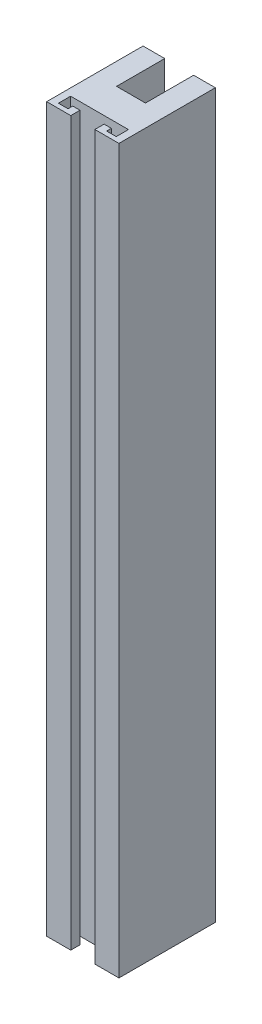
ISO-10303-21;
HEADER;
FILE_DESCRIPTION(('STEP AP214'),'2;1');
FILE_NAME('part.step','',(''),(''),'','','');
FILE_SCHEMA(('AUTOMOTIVE_DESIGN { 1 0 10303 214 1 1 1 1 }'));
ENDSEC;
DATA;
#1=APPLICATION_CONTEXT('core data for automotive mechanical design processes');
#2=APPLICATION_PROTOCOL_DEFINITION('international standard','automotive_design',2000,#1);
#3=PRODUCT_CONTEXT('',#1,'mechanical');
#4=PRODUCT('Part','Part','',(#3));
#5=PRODUCT_RELATED_PRODUCT_CATEGORY('part','',(#4));
#6=PRODUCT_DEFINITION_FORMATION('','',#4);
#7=PRODUCT_DEFINITION_CONTEXT('part definition',#1,'design');
#8=PRODUCT_DEFINITION('design','',#6,#7);
#9=PRODUCT_DEFINITION_SHAPE('','',#8);
#10=(LENGTH_UNIT() NAMED_UNIT(*) SI_UNIT(.MILLI.,.METRE.));
#11=(NAMED_UNIT(*) PLANE_ANGLE_UNIT() SI_UNIT($,.RADIAN.));
#12=(NAMED_UNIT(*) SI_UNIT($,.STERADIAN.) SOLID_ANGLE_UNIT());
#13=UNCERTAINTY_MEASURE_WITH_UNIT(LENGTH_MEASURE(1.E-05),#10,'distance_accuracy_value','');
#14=(GEOMETRIC_REPRESENTATION_CONTEXT(3) GLOBAL_UNCERTAINTY_ASSIGNED_CONTEXT((#13)) GLOBAL_UNIT_ASSIGNED_CONTEXT((#10,
#11,#12)) REPRESENTATION_CONTEXT('',''));
#15=CARTESIAN_POINT('',(0.,0.,0.));
#16=DIRECTION('',(0.,0.,1.));
#17=DIRECTION('',(1.,0.,0.));
#18=AXIS2_PLACEMENT_3D('',#15,#16,#17);
#19=CARTESIAN_POINT('',(3.,150.,-7.5));
#20=DIRECTION('',(0.,0.,1.));
#21=DIRECTION('',(1.,0.,0.));
#22=AXIS2_PLACEMENT_3D('',#19,#20,#21);
#23=PLANE('',#22);
#24=DIRECTION('',(-1.,0.,0.));
#25=VECTOR('',#24,1.);
#26=CARTESIAN_POINT('',(3.,0.,-7.5));
#27=LINE('',#26,#25);
#28=CARTESIAN_POINT('',(7.5,0.,-7.5));
#29=VERTEX_POINT('',#28);
#30=CARTESIAN_POINT('',(3.,0.,-7.5));
#31=VERTEX_POINT('',#30);
#32=EDGE_CURVE('E208',#29,#31,#27,.T.);
#33=ORIENTED_EDGE('',*,*,#32,.T.);
#34=DIRECTION('',(0.,-1.,0.));
#35=VECTOR('',#34,1.);
#36=CARTESIAN_POINT('',(3.,150.,-7.5));
#37=LINE('',#36,#35);
#38=CARTESIAN_POINT('',(3.,150.,-7.5));
#39=VERTEX_POINT('',#38);
#40=EDGE_CURVE('E44',#39,#31,#37,.T.);
#41=ORIENTED_EDGE('',*,*,#40,.F.);
#42=DIRECTION('',(-1.,0.,0.));
#43=VECTOR('',#42,1.);
#44=CARTESIAN_POINT('',(3.,150.,-7.5));
#45=LINE('',#44,#43);
#46=CARTESIAN_POINT('',(7.5,150.,-7.5));
#47=VERTEX_POINT('',#46);
#48=EDGE_CURVE('E132',#47,#39,#45,.T.);
#49=ORIENTED_EDGE('',*,*,#48,.F.);
#50=DIRECTION('',(0.,-1.,0.));
#51=VECTOR('',#50,1.);
#52=CARTESIAN_POINT('',(7.5,150.,-7.5));
#53=LINE('',#52,#51);
#54=EDGE_CURVE('E11',#47,#29,#53,.T.);
#55=ORIENTED_EDGE('',*,*,#54,.T.);
#56=EDGE_LOOP('',(#33,#41,#49,#55));
#57=FACE_BOUND('',#56,.T.);
#58=ADVANCED_FACE('F36',(#57),#23,.F.);
#59=CARTESIAN_POINT('',(3.,150.,2.5));
#60=DIRECTION('',(1.,0.,0.));
#61=DIRECTION('',(0.,0.,-1.));
#62=AXIS2_PLACEMENT_3D('',#59,#60,#61);
#63=PLANE('',#62);
#64=DIRECTION('',(0.,0.,1.));
#65=VECTOR('',#64,1.);
#66=CARTESIAN_POINT('',(3.,0.,2.5));
#67=LINE('',#66,#65);
#68=CARTESIAN_POINT('',(3.,0.,2.5));
#69=VERTEX_POINT('',#68);
#70=EDGE_CURVE('E210',#31,#69,#67,.T.);
#71=ORIENTED_EDGE('',*,*,#70,.T.);
#72=DIRECTION('',(0.,-1.,0.));
#73=VECTOR('',#72,1.);
#74=CARTESIAN_POINT('',(3.,150.,2.5));
#75=LINE('',#74,#73);
#76=CARTESIAN_POINT('',(3.,150.,2.5));
#77=VERTEX_POINT('',#76);
#78=EDGE_CURVE('E288',#77,#69,#75,.T.);
#79=ORIENTED_EDGE('',*,*,#78,.F.);
#80=DIRECTION('',(0.,0.,1.));
#81=VECTOR('',#80,1.);
#82=CARTESIAN_POINT('',(3.,150.,2.5));
#83=LINE('',#82,#81);
#84=EDGE_CURVE('E296',#39,#77,#83,.T.);
#85=ORIENTED_EDGE('',*,*,#84,.F.);
#86=ORIENTED_EDGE('',*,*,#40,.T.);
#87=EDGE_LOOP('',(#71,#79,#85,#86));
#88=FACE_BOUND('',#87,.T.);
#89=ADVANCED_FACE('F294',(#88),#63,.F.);
#90=CARTESIAN_POINT('',(-3.,150.,2.5));
#91=DIRECTION('',(0.,0.,1.));
#92=DIRECTION('',(1.,0.,0.));
#93=AXIS2_PLACEMENT_3D('',#90,#91,#92);
#94=PLANE('',#93);
#95=DIRECTION('',(-1.,0.,0.));
#96=VECTOR('',#95,1.);
#97=CARTESIAN_POINT('',(-3.,0.,2.5));
#98=LINE('',#97,#96);
#99=CARTESIAN_POINT('',(-3.,0.,2.5));
#100=VERTEX_POINT('',#99);
#101=EDGE_CURVE('E212',#69,#100,#98,.T.);
#102=ORIENTED_EDGE('',*,*,#101,.T.);
#103=DIRECTION('',(0.,-1.,0.));
#104=VECTOR('',#103,1.);
#105=CARTESIAN_POINT('',(-3.,150.,2.5));
#106=LINE('',#105,#104);
#107=CARTESIAN_POINT('',(-3.,150.,2.5));
#108=VERTEX_POINT('',#107);
#109=EDGE_CURVE('E285',#108,#100,#106,.T.);
#110=ORIENTED_EDGE('',*,*,#109,.F.);
#111=DIRECTION('',(-1.,0.,0.));
#112=VECTOR('',#111,1.);
#113=CARTESIAN_POINT('',(-3.,150.,2.5));
#114=LINE('',#113,#112);
#115=EDGE_CURVE('E315',#77,#108,#114,.T.);
#116=ORIENTED_EDGE('',*,*,#115,.F.);
#117=ORIENTED_EDGE('',*,*,#78,.T.);
#118=EDGE_LOOP('',(#102,#110,#116,#117));
#119=FACE_BOUND('',#118,.T.);
#120=ADVANCED_FACE('F306',(#119),#94,.F.);
#121=CARTESIAN_POINT('',(-3.,150.,2.5));
#122=DIRECTION('',(-1.,0.,0.));
#123=DIRECTION('',(0.,0.,1.));
#124=AXIS2_PLACEMENT_3D('',#121,#122,#123);
#125=PLANE('',#124);
#126=DIRECTION('',(0.,0.,-1.));
#127=VECTOR('',#126,1.);
#128=CARTESIAN_POINT('',(-3.,0.,2.5));
#129=LINE('',#128,#127);
#130=CARTESIAN_POINT('',(-3.,0.,-7.5));
#131=VERTEX_POINT('',#130);
#132=EDGE_CURVE('E214',#100,#131,#129,.T.);
#133=ORIENTED_EDGE('',*,*,#132,.T.);
#134=DIRECTION('',(0.,-1.,0.));
#135=VECTOR('',#134,1.);
#136=CARTESIAN_POINT('',(-3.,150.,-7.5));
#137=LINE('',#136,#135);
#138=CARTESIAN_POINT('',(-3.,150.,-7.5));
#139=VERTEX_POINT('',#138);
#140=EDGE_CURVE('E282',#139,#131,#137,.T.);
#141=ORIENTED_EDGE('',*,*,#140,.F.);
#142=DIRECTION('',(0.,0.,-1.));
#143=VECTOR('',#142,1.);
#144=CARTESIAN_POINT('',(-3.,150.,2.5));
#145=LINE('',#144,#143);
#146=EDGE_CURVE('E312',#108,#139,#145,.T.);
#147=ORIENTED_EDGE('',*,*,#146,.F.);
#148=ORIENTED_EDGE('',*,*,#109,.T.);
#149=EDGE_LOOP('',(#133,#141,#147,#148));
#150=FACE_BOUND('',#149,.T.);
#151=ADVANCED_FACE('F310',(#150),#125,.F.);
#152=CARTESIAN_POINT('',(-7.5,150.,-7.5));
#153=DIRECTION('',(0.,0.,1.));
#154=DIRECTION('',(1.,0.,0.));
#155=AXIS2_PLACEMENT_3D('',#152,#153,#154);
#156=PLANE('',#155);
#157=DIRECTION('',(-1.,0.,0.));
#158=VECTOR('',#157,1.);
#159=CARTESIAN_POINT('',(-7.5,0.,-7.5));
#160=LINE('',#159,#158);
#161=CARTESIAN_POINT('',(-7.5,0.,-7.5));
#162=VERTEX_POINT('',#161);
#163=EDGE_CURVE('E216',#131,#162,#160,.T.);
#164=ORIENTED_EDGE('',*,*,#163,.T.);
#165=DIRECTION('',(0.,-1.,0.));
#166=VECTOR('',#165,1.);
#167=CARTESIAN_POINT('',(-7.5,150.,-7.5));
#168=LINE('',#167,#166);
#169=CARTESIAN_POINT('',(-7.5,150.,-7.5));
#170=VERTEX_POINT('',#169);
#171=EDGE_CURVE('E279',#170,#162,#168,.T.);
#172=ORIENTED_EDGE('',*,*,#171,.F.);
#173=DIRECTION('',(-1.,0.,0.));
#174=VECTOR('',#173,1.);
#175=CARTESIAN_POINT('',(-7.5,150.,-7.5));
#176=LINE('',#175,#174);
#177=EDGE_CURVE('E314',#139,#170,#176,.T.);
#178=ORIENTED_EDGE('',*,*,#177,.F.);
#179=ORIENTED_EDGE('',*,*,#140,.T.);
#180=EDGE_LOOP('',(#164,#172,#178,#179));
#181=FACE_BOUND('',#180,.T.);
#182=ADVANCED_FACE('F373',(#181),#156,.F.);
#183=CARTESIAN_POINT('',(-7.5,150.,7.5));
#184=DIRECTION('',(1.,0.,0.));
#185=DIRECTION('',(0.,0.,-1.));
#186=AXIS2_PLACEMENT_3D('',#183,#184,#185);
#187=PLANE('',#186);
#188=DIRECTION('',(0.,0.,1.));
#189=VECTOR('',#188,1.);
#190=CARTESIAN_POINT('',(-7.5,0.,7.5));
#191=LINE('',#190,#189);
#192=CARTESIAN_POINT('',(-7.5,0.,12.5047377));
#193=VERTEX_POINT('',#192);
#194=EDGE_CURVE('E219',#162,#193,#191,.T.);
#195=ORIENTED_EDGE('',*,*,#194,.T.);
#196=DIRECTION('',(0.,-1.,0.));
#197=VECTOR('',#196,1.);
#198=CARTESIAN_POINT('',(-7.5,150.,12.5047377));
#199=LINE('',#198,#197);
#200=CARTESIAN_POINT('',(-7.5,150.,12.5047377));
#201=VERTEX_POINT('',#200);
#202=EDGE_CURVE('E276',#201,#193,#199,.T.);
#203=ORIENTED_EDGE('',*,*,#202,.F.);
#204=DIRECTION('',(0.,0.,1.));
#205=VECTOR('',#204,1.);
#206=CARTESIAN_POINT('',(-7.5,150.,7.5));
#207=LINE('',#206,#205);
#208=EDGE_CURVE('E317',#170,#201,#207,.T.);
#209=ORIENTED_EDGE('',*,*,#208,.F.);
#210=ORIENTED_EDGE('',*,*,#171,.T.);
#211=EDGE_LOOP('',(#195,#203,#209,#210));
#212=FACE_BOUND('',#211,.T.);
#213=ADVANCED_FACE('F376',(#212),#187,.F.);
#214=CARTESIAN_POINT('',(-7.5,150.,12.5047377));
#215=DIRECTION('',(0.,0.,-1.));
#216=DIRECTION('',(-1.,0.,0.));
#217=AXIS2_PLACEMENT_3D('',#214,#215,#216);
#218=PLANE('',#217);
#219=DIRECTION('',(1.,0.,0.));
#220=VECTOR('',#219,1.);
#221=CARTESIAN_POINT('',(-7.5,0.,12.5047377));
#222=LINE('',#221,#220);
#223=CARTESIAN_POINT('',(-2.5,0.,12.5047377));
#224=VERTEX_POINT('',#223);
#225=EDGE_CURVE('E221',#193,#224,#222,.T.);
#226=ORIENTED_EDGE('',*,*,#225,.T.);
#227=DIRECTION('',(0.,-1.,0.));
#228=VECTOR('',#227,1.);
#229=CARTESIAN_POINT('',(-2.5,150.,12.5047377));
#230=LINE('',#229,#228);
#231=CARTESIAN_POINT('',(-2.5,150.,12.5047377));
#232=VERTEX_POINT('',#231);
#233=EDGE_CURVE('E273',#232,#224,#230,.T.);
#234=ORIENTED_EDGE('',*,*,#233,.F.);
#235=DIRECTION('',(1.,0.,0.));
#236=VECTOR('',#235,1.);
#237=CARTESIAN_POINT('',(-7.5,150.,12.5047377));
#238=LINE('',#237,#236);
#239=EDGE_CURVE('E323',#201,#232,#238,.T.);
#240=ORIENTED_EDGE('',*,*,#239,.F.);
#241=ORIENTED_EDGE('',*,*,#202,.T.);
#242=EDGE_LOOP('',(#226,#234,#240,#241));
#243=FACE_BOUND('',#242,.T.);
#244=ADVANCED_FACE('F380',(#243),#218,.F.);
#245=CARTESIAN_POINT('',(-2.5,150.,12.5047377));
#246=DIRECTION('',(-1.,0.,0.));
#247=DIRECTION('',(0.,0.,1.));
#248=AXIS2_PLACEMENT_3D('',#245,#246,#247);
#249=PLANE('',#248);
#250=DIRECTION('',(0.,0.,-1.));
#251=VECTOR('',#250,1.);
#252=CARTESIAN_POINT('',(-2.5,0.,12.5047377));
#253=LINE('',#252,#251);
#254=CARTESIAN_POINT('',(-2.5,0.,10.5850596243789));
#255=VERTEX_POINT('',#254);
#256=EDGE_CURVE('E223',#224,#255,#253,.T.);
#257=ORIENTED_EDGE('',*,*,#256,.T.);
#258=DIRECTION('',(0.,-1.,0.));
#259=VECTOR('',#258,1.);
#260=CARTESIAN_POINT('',(-2.5,150.,10.5850596243789));
#261=LINE('',#260,#259);
#262=CARTESIAN_POINT('',(-2.5,150.,10.5850596243789));
#263=VERTEX_POINT('',#262);
#264=EDGE_CURVE('E270',#263,#255,#261,.T.);
#265=ORIENTED_EDGE('',*,*,#264,.F.);
#266=DIRECTION('',(0.,0.,-1.));
#267=VECTOR('',#266,1.);
#268=CARTESIAN_POINT('',(-2.5,150.,12.5047377));
#269=LINE('',#268,#267);
#270=EDGE_CURVE('E325',#232,#263,#269,.T.);
#271=ORIENTED_EDGE('',*,*,#270,.F.);
#272=ORIENTED_EDGE('',*,*,#233,.T.);
#273=EDGE_LOOP('',(#257,#265,#271,#272));
#274=FACE_BOUND('',#273,.T.);
#275=ADVANCED_FACE('F384',(#274),#249,.F.);
#276=CARTESIAN_POINT('',(-2.5,150.,10.5850596243789));
#277=DIRECTION('',(0.,0.,1.));
#278=DIRECTION('',(1.,0.,0.));
#279=AXIS2_PLACEMENT_3D('',#276,#277,#278);
#280=PLANE('',#279);
#281=DIRECTION('',(-1.,0.,0.));
#282=VECTOR('',#281,1.);
#283=CARTESIAN_POINT('',(-2.5,0.,10.5850596243789));
#284=LINE('',#283,#282);
#285=CARTESIAN_POINT('',(-4.,0.,10.5850596243789));
#286=VERTEX_POINT('',#285);
#287=EDGE_CURVE('E225',#255,#286,#284,.T.);
#288=ORIENTED_EDGE('',*,*,#287,.T.);
#289=DIRECTION('',(0.,-1.,0.));
#290=VECTOR('',#289,1.);
#291=CARTESIAN_POINT('',(-4.,150.,10.5850596243789));
#292=LINE('',#291,#290);
#293=CARTESIAN_POINT('',(-4.,150.,10.5850596243789));
#294=VERTEX_POINT('',#293);
#295=EDGE_CURVE('E267',#294,#286,#292,.T.);
#296=ORIENTED_EDGE('',*,*,#295,.F.);
#297=DIRECTION('',(-1.,0.,0.));
#298=VECTOR('',#297,1.);
#299=CARTESIAN_POINT('',(-2.5,150.,10.5850596243789));
#300=LINE('',#299,#298);
#301=EDGE_CURVE('E327',#263,#294,#300,.T.);
#302=ORIENTED_EDGE('',*,*,#301,.F.);
#303=ORIENTED_EDGE('',*,*,#264,.T.);
#304=EDGE_LOOP('',(#288,#296,#302,#303));
#305=FACE_BOUND('',#304,.T.);
#306=ADVANCED_FACE('F388',(#305),#280,.F.);
#307=CARTESIAN_POINT('',(-4.,150.,10.5850596243789));
#308=DIRECTION('',(1.,0.,0.));
#309=DIRECTION('',(0.,0.,-1.));
#310=AXIS2_PLACEMENT_3D('',#307,#308,#309);
#311=PLANE('',#310);
#312=DIRECTION('',(0.,0.,1.));
#313=VECTOR('',#312,1.);
#314=CARTESIAN_POINT('',(-4.,0.,10.5850596243789));
#315=LINE('',#314,#313);
#316=CARTESIAN_POINT('',(-4.,0.,11.5647377));
#317=VERTEX_POINT('',#316);
#318=EDGE_CURVE('E227',#286,#317,#315,.T.);
#319=ORIENTED_EDGE('',*,*,#318,.T.);
#320=DIRECTION('',(0.,-1.,0.));
#321=VECTOR('',#320,1.);
#322=CARTESIAN_POINT('',(-4.,150.,11.5647377));
#323=LINE('',#322,#321);
#324=CARTESIAN_POINT('',(-4.,150.,11.5647377));
#325=VERTEX_POINT('',#324);
#326=EDGE_CURVE('E264',#325,#317,#323,.T.);
#327=ORIENTED_EDGE('',*,*,#326,.F.);
#328=DIRECTION('',(0.,0.,1.));
#329=VECTOR('',#328,1.);
#330=CARTESIAN_POINT('',(-4.,150.,10.5850596243789));
#331=LINE('',#330,#329);
#332=EDGE_CURVE('E329',#294,#325,#331,.T.);
#333=ORIENTED_EDGE('',*,*,#332,.F.);
#334=ORIENTED_EDGE('',*,*,#295,.T.);
#335=EDGE_LOOP('',(#319,#327,#333,#334));
#336=FACE_BOUND('',#335,.T.);
#337=ADVANCED_FACE('F392',(#336),#311,.F.);
#338=CARTESIAN_POINT('',(-4.,150.,11.5647377));
#339=DIRECTION('',(0.,0.,1.));
#340=DIRECTION('',(1.,0.,0.));
#341=AXIS2_PLACEMENT_3D('',#338,#339,#340);
#342=PLANE('',#341);
#343=DIRECTION('',(-1.,0.,0.));
#344=VECTOR('',#343,1.);
#345=CARTESIAN_POINT('',(-4.,0.,11.5647377));
#346=LINE('',#345,#344);
#347=CARTESIAN_POINT('',(-6.,0.,11.5647377));
#348=VERTEX_POINT('',#347);
#349=EDGE_CURVE('E229',#317,#348,#346,.T.);
#350=ORIENTED_EDGE('',*,*,#349,.T.);
#351=DIRECTION('',(0.,-1.,0.));
#352=VECTOR('',#351,1.);
#353=CARTESIAN_POINT('',(-6.,150.,11.5647377));
#354=LINE('',#353,#352);
#355=CARTESIAN_POINT('',(-6.,150.,11.5647377));
#356=VERTEX_POINT('',#355);
#357=EDGE_CURVE('E261',#356,#348,#354,.T.);
#358=ORIENTED_EDGE('',*,*,#357,.F.);
#359=DIRECTION('',(-1.,0.,0.));
#360=VECTOR('',#359,1.);
#361=CARTESIAN_POINT('',(-4.,150.,11.5647377));
#362=LINE('',#361,#360);
#363=EDGE_CURVE('E331',#325,#356,#362,.T.);
#364=ORIENTED_EDGE('',*,*,#363,.F.);
#365=ORIENTED_EDGE('',*,*,#326,.T.);
#366=EDGE_LOOP('',(#350,#358,#364,#365));
#367=FACE_BOUND('',#366,.T.);
#368=ADVANCED_FACE('F396',(#367),#342,.F.);
#369=CARTESIAN_POINT('',(-6.,150.,11.5647377));
#370=DIRECTION('',(-1.,0.,0.));
#371=DIRECTION('',(0.,0.,1.));
#372=AXIS2_PLACEMENT_3D('',#369,#370,#371);
#373=PLANE('',#372);
#374=DIRECTION('',(0.,0.,-1.));
#375=VECTOR('',#374,1.);
#376=CARTESIAN_POINT('',(-6.,0.,11.5647377));
#377=LINE('',#376,#375);
#378=CARTESIAN_POINT('',(-6.,0.,9.0360929606328));
#379=VERTEX_POINT('',#378);
#380=EDGE_CURVE('E231',#348,#379,#377,.T.);
#381=ORIENTED_EDGE('',*,*,#380,.T.);
#382=DIRECTION('',(0.,-1.,0.));
#383=VECTOR('',#382,1.);
#384=CARTESIAN_POINT('',(-6.,150.,9.0360929606328));
#385=LINE('',#384,#383);
#386=CARTESIAN_POINT('',(-6.,150.,9.0360929606328));
#387=VERTEX_POINT('',#386);
#388=EDGE_CURVE('E258',#387,#379,#385,.T.);
#389=ORIENTED_EDGE('',*,*,#388,.F.);
#390=DIRECTION('',(0.,0.,-1.));
#391=VECTOR('',#390,1.);
#392=CARTESIAN_POINT('',(-6.,150.,11.5647377));
#393=LINE('',#392,#391);
#394=EDGE_CURVE('E333',#356,#387,#393,.T.);
#395=ORIENTED_EDGE('',*,*,#394,.F.);
#396=ORIENTED_EDGE('',*,*,#357,.T.);
#397=EDGE_LOOP('',(#381,#389,#395,#396));
#398=FACE_BOUND('',#397,.T.);
#399=ADVANCED_FACE('F400',(#398),#373,.F.);
#400=CARTESIAN_POINT('',(5.99999999999999,150.,9.0360929606328));
#401=DIRECTION('',(0.,0.,-1.));
#402=DIRECTION('',(-1.,0.,0.));
#403=AXIS2_PLACEMENT_3D('',#400,#401,#402);
#404=PLANE('',#403);
#405=DIRECTION('',(1.,0.,0.));
#406=VECTOR('',#405,1.);
#407=CARTESIAN_POINT('',(5.99999999999999,0.,9.0360929606328));
#408=LINE('',#407,#406);
#409=CARTESIAN_POINT('',(5.99999999999999,0.,9.0360929606328));
#410=VERTEX_POINT('',#409);
#411=EDGE_CURVE('E233',#379,#410,#408,.T.);
#412=ORIENTED_EDGE('',*,*,#411,.T.);
#413=DIRECTION('',(0.,-1.,0.));
#414=VECTOR('',#413,1.);
#415=CARTESIAN_POINT('',(5.99999999999999,150.,9.0360929606328));
#416=LINE('',#415,#414);
#417=CARTESIAN_POINT('',(5.99999999999999,150.,9.0360929606328));
#418=VERTEX_POINT('',#417);
#419=EDGE_CURVE('E255',#418,#410,#416,.T.);
#420=ORIENTED_EDGE('',*,*,#419,.F.);
#421=DIRECTION('',(1.,0.,0.));
#422=VECTOR('',#421,1.);
#423=CARTESIAN_POINT('',(5.99999999999999,150.,9.0360929606328));
#424=LINE('',#423,#422);
#425=EDGE_CURVE('E335',#387,#418,#424,.T.);
#426=ORIENTED_EDGE('',*,*,#425,.F.);
#427=ORIENTED_EDGE('',*,*,#388,.T.);
#428=EDGE_LOOP('',(#412,#420,#426,#427));
#429=FACE_BOUND('',#428,.T.);
#430=ADVANCED_FACE('F404',(#429),#404,.F.);
#431=CARTESIAN_POINT('',(6.,150.,11.566741313464));
#432=DIRECTION('',(1.,0.,0.));
#433=DIRECTION('',(0.,0.,-1.));
#434=AXIS2_PLACEMENT_3D('',#431,#432,#433);
#435=PLANE('',#434);
#436=DIRECTION('',(0.,0.,1.));
#437=VECTOR('',#436,1.);
#438=CARTESIAN_POINT('',(6.,0.,11.566741313464));
#439=LINE('',#438,#437);
#440=CARTESIAN_POINT('',(6.,0.,11.566741313464));
#441=VERTEX_POINT('',#440);
#442=EDGE_CURVE('E235',#410,#441,#439,.T.);
#443=ORIENTED_EDGE('',*,*,#442,.T.);
#444=DIRECTION('',(0.,-1.,0.));
#445=VECTOR('',#444,1.);
#446=CARTESIAN_POINT('',(6.,150.,11.566741313464));
#447=LINE('',#446,#445);
#448=CARTESIAN_POINT('',(6.,150.,11.566741313464));
#449=VERTEX_POINT('',#448);
#450=EDGE_CURVE('E252',#449,#441,#447,.T.);
#451=ORIENTED_EDGE('',*,*,#450,.F.);
#452=DIRECTION('',(0.,0.,1.));
#453=VECTOR('',#452,1.);
#454=CARTESIAN_POINT('',(6.,150.,11.566741313464));
#455=LINE('',#454,#453);
#456=EDGE_CURVE('E337',#418,#449,#455,.T.);
#457=ORIENTED_EDGE('',*,*,#456,.F.);
#458=ORIENTED_EDGE('',*,*,#419,.T.);
#459=EDGE_LOOP('',(#443,#451,#457,#458));
#460=FACE_BOUND('',#459,.T.);
#461=ADVANCED_FACE('F408',(#460),#435,.F.);
#462=CARTESIAN_POINT('',(3.99999999999999,150.,11.566741313464));
#463=DIRECTION('',(0.,0.,1.));
#464=DIRECTION('',(1.,0.,0.));
#465=AXIS2_PLACEMENT_3D('',#462,#463,#464);
#466=PLANE('',#465);
#467=DIRECTION('',(-1.,0.,0.));
#468=VECTOR('',#467,1.);
#469=CARTESIAN_POINT('',(3.99999999999999,0.,11.566741313464));
#470=LINE('',#469,#468);
#471=CARTESIAN_POINT('',(3.99999999999999,0.,11.566741313464));
#472=VERTEX_POINT('',#471);
#473=EDGE_CURVE('E237',#441,#472,#470,.T.);
#474=ORIENTED_EDGE('',*,*,#473,.T.);
#475=DIRECTION('',(0.,-1.,0.));
#476=VECTOR('',#475,1.);
#477=CARTESIAN_POINT('',(3.99999999999999,150.,11.566741313464));
#478=LINE('',#477,#476);
#479=CARTESIAN_POINT('',(3.99999999999999,150.,11.566741313464));
#480=VERTEX_POINT('',#479);
#481=EDGE_CURVE('E249',#480,#472,#478,.T.);
#482=ORIENTED_EDGE('',*,*,#481,.F.);
#483=DIRECTION('',(-1.,0.,0.));
#484=VECTOR('',#483,1.);
#485=CARTESIAN_POINT('',(3.99999999999999,150.,11.566741313464));
#486=LINE('',#485,#484);
#487=EDGE_CURVE('E339',#449,#480,#486,.T.);
#488=ORIENTED_EDGE('',*,*,#487,.F.);
#489=ORIENTED_EDGE('',*,*,#450,.T.);
#490=EDGE_LOOP('',(#474,#482,#488,#489));
#491=FACE_BOUND('',#490,.T.);
#492=ADVANCED_FACE('F345',(#491),#466,.F.);
#493=CARTESIAN_POINT('',(3.99999999999999,150.,10.5847377));
#494=DIRECTION('',(-1.,0.,0.));
#495=DIRECTION('',(0.,0.,1.));
#496=AXIS2_PLACEMENT_3D('',#493,#494,#495);
#497=PLANE('',#496);
#498=DIRECTION('',(0.,0.,-1.));
#499=VECTOR('',#498,1.);
#500=CARTESIAN_POINT('',(3.99999999999999,0.,10.5847377));
#501=LINE('',#500,#499);
#502=CARTESIAN_POINT('',(3.99999999999999,0.,10.5847377));
#503=VERTEX_POINT('',#502);
#504=EDGE_CURVE('E239',#472,#503,#501,.T.);
#505=ORIENTED_EDGE('',*,*,#504,.T.);
#506=DIRECTION('',(0.,-1.,0.));
#507=VECTOR('',#506,1.);
#508=CARTESIAN_POINT('',(3.99999999999999,150.,10.5847377));
#509=LINE('',#508,#507);
#510=CARTESIAN_POINT('',(3.99999999999999,150.,10.5847377));
#511=VERTEX_POINT('',#510);
#512=EDGE_CURVE('E197',#511,#503,#509,.T.);
#513=ORIENTED_EDGE('',*,*,#512,.F.);
#514=DIRECTION('',(0.,0.,-1.));
#515=VECTOR('',#514,1.);
#516=CARTESIAN_POINT('',(3.99999999999999,150.,10.5847377));
#517=LINE('',#516,#515);
#518=EDGE_CURVE('E188',#480,#511,#517,.T.);
#519=ORIENTED_EDGE('',*,*,#518,.F.);
#520=ORIENTED_EDGE('',*,*,#481,.T.);
#521=EDGE_LOOP('',(#505,#513,#519,#520));
#522=FACE_BOUND('',#521,.T.);
#523=ADVANCED_FACE('F349',(#522),#497,.F.);
#524=CARTESIAN_POINT('',(2.5,150.,10.5847377));
#525=DIRECTION('',(0.,0.,1.));
#526=DIRECTION('',(1.,0.,0.));
#527=AXIS2_PLACEMENT_3D('',#524,#525,#526);
#528=PLANE('',#527);
#529=DIRECTION('',(-1.,0.,0.));
#530=VECTOR('',#529,1.);
#531=CARTESIAN_POINT('',(2.5,0.,10.5847377));
#532=LINE('',#531,#530);
#533=CARTESIAN_POINT('',(2.5,0.,10.5847377));
#534=VERTEX_POINT('',#533);
#535=EDGE_CURVE('E196',#503,#534,#532,.T.);
#536=ORIENTED_EDGE('',*,*,#535,.T.);
#537=DIRECTION('',(0.,-1.,0.));
#538=VECTOR('',#537,1.);
#539=CARTESIAN_POINT('',(2.5,150.,10.5847377));
#540=LINE('',#539,#538);
#541=CARTESIAN_POINT('',(2.5,150.,10.5847377));
#542=VERTEX_POINT('',#541);
#543=EDGE_CURVE('E193',#542,#534,#540,.T.);
#544=ORIENTED_EDGE('',*,*,#543,.F.);
#545=DIRECTION('',(-1.,0.,0.));
#546=VECTOR('',#545,1.);
#547=CARTESIAN_POINT('',(2.5,150.,10.5847377));
#548=LINE('',#547,#546);
#549=EDGE_CURVE('E182',#511,#542,#548,.T.);
#550=ORIENTED_EDGE('',*,*,#549,.F.);
#551=ORIENTED_EDGE('',*,*,#512,.T.);
#552=EDGE_LOOP('',(#536,#544,#550,#551));
#553=FACE_BOUND('',#552,.T.);
#554=ADVANCED_FACE('F194',(#553),#528,.F.);
#555=CARTESIAN_POINT('',(2.5,150.,12.5047377));
#556=DIRECTION('',(1.,0.,0.));
#557=DIRECTION('',(0.,0.,-1.));
#558=AXIS2_PLACEMENT_3D('',#555,#556,#557);
#559=PLANE('',#558);
#560=DIRECTION('',(0.,0.,1.));
#561=VECTOR('',#560,1.);
#562=CARTESIAN_POINT('',(2.5,0.,12.5047377));
#563=LINE('',#562,#561);
#564=CARTESIAN_POINT('',(2.5,0.,12.5047377));
#565=VERTEX_POINT('',#564);
#566=EDGE_CURVE('E118',#534,#565,#563,.T.);
#567=ORIENTED_EDGE('',*,*,#566,.T.);
#568=DIRECTION('',(0.,-1.,0.));
#569=VECTOR('',#568,1.);
#570=CARTESIAN_POINT('',(2.5,150.,12.5047377));
#571=LINE('',#570,#569);
#572=CARTESIAN_POINT('',(2.5,150.,12.5047377));
#573=VERTEX_POINT('',#572);
#574=EDGE_CURVE('E198',#573,#565,#571,.T.);
#575=ORIENTED_EDGE('',*,*,#574,.F.);
#576=DIRECTION('',(0.,0.,1.));
#577=VECTOR('',#576,1.);
#578=CARTESIAN_POINT('',(2.5,150.,12.5047377));
#579=LINE('',#578,#577);
#580=EDGE_CURVE('E186',#542,#573,#579,.T.);
#581=ORIENTED_EDGE('',*,*,#580,.F.);
#582=ORIENTED_EDGE('',*,*,#543,.T.);
#583=EDGE_LOOP('',(#567,#575,#581,#582));
#584=FACE_BOUND('',#583,.T.);
#585=ADVANCED_FACE('F200',(#584),#559,.F.);
#586=CARTESIAN_POINT('',(7.5,150.,12.5047377));
#587=DIRECTION('',(0.,0.,-1.));
#588=DIRECTION('',(-1.,0.,0.));
#589=AXIS2_PLACEMENT_3D('',#586,#587,#588);
#590=PLANE('',#589);
#591=DIRECTION('',(1.,0.,0.));
#592=VECTOR('',#591,1.);
#593=CARTESIAN_POINT('',(7.5,0.,12.5047377));
#594=LINE('',#593,#592);
#595=CARTESIAN_POINT('',(7.5,0.,12.5047377));
#596=VERTEX_POINT('',#595);
#597=EDGE_CURVE('E125',#565,#596,#594,.T.);
#598=ORIENTED_EDGE('',*,*,#597,.T.);
#599=DIRECTION('',(0.,-1.,0.));
#600=VECTOR('',#599,1.);
#601=CARTESIAN_POINT('',(7.5,150.,12.5047377));
#602=LINE('',#601,#600);
#603=CARTESIAN_POINT('',(7.5,150.,12.5047377));
#604=VERTEX_POINT('',#603);
#605=EDGE_CURVE('E204',#604,#596,#602,.T.);
#606=ORIENTED_EDGE('',*,*,#605,.F.);
#607=DIRECTION('',(1.,0.,0.));
#608=VECTOR('',#607,1.);
#609=CARTESIAN_POINT('',(7.5,150.,12.5047377));
#610=LINE('',#609,#608);
#611=EDGE_CURVE('E202',#573,#604,#610,.T.);
#612=ORIENTED_EDGE('',*,*,#611,.F.);
#613=ORIENTED_EDGE('',*,*,#574,.T.);
#614=EDGE_LOOP('',(#598,#606,#612,#613));
#615=FACE_BOUND('',#614,.T.);
#616=ADVANCED_FACE('F351',(#615),#590,.F.);
#617=CARTESIAN_POINT('',(7.5,150.,7.5));
#618=DIRECTION('',(-1.,0.,0.));
#619=DIRECTION('',(0.,0.,1.));
#620=AXIS2_PLACEMENT_3D('',#617,#618,#619);
#621=PLANE('',#620);
#622=DIRECTION('',(0.,0.,-1.));
#623=VECTOR('',#622,1.);
#624=CARTESIAN_POINT('',(7.5,0.,7.5));
#625=LINE('',#624,#623);
#626=EDGE_CURVE('E244',#596,#29,#625,.T.);
#627=ORIENTED_EDGE('',*,*,#626,.T.);
#628=ORIENTED_EDGE('',*,*,#54,.F.);
#629=DIRECTION('',(0.,0.,-1.));
#630=VECTOR('',#629,1.);
#631=CARTESIAN_POINT('',(7.5,150.,7.5));
#632=LINE('',#631,#630);
#633=EDGE_CURVE('E52',#604,#47,#632,.T.);
#634=ORIENTED_EDGE('',*,*,#633,.F.);
#635=ORIENTED_EDGE('',*,*,#605,.T.);
#636=EDGE_LOOP('',(#627,#628,#634,#635));
#637=FACE_BOUND('',#636,.T.);
#638=ADVANCED_FACE('F350',(#637),#621,.F.);
#639=CARTESIAN_POINT('',(0.,150.,0.));
#640=DIRECTION('',(0.,-1.,0.));
#641=DIRECTION('',(0.,0.,-1.));
#642=AXIS2_PLACEMENT_3D('',#639,#640,#641);
#643=PLANE('',#642);
#644=ORIENTED_EDGE('',*,*,#633,.T.);
#645=ORIENTED_EDGE('',*,*,#48,.T.);
#646=ORIENTED_EDGE('',*,*,#84,.T.);
#647=ORIENTED_EDGE('',*,*,#115,.T.);
#648=ORIENTED_EDGE('',*,*,#146,.T.);
#649=ORIENTED_EDGE('',*,*,#177,.T.);
#650=ORIENTED_EDGE('',*,*,#208,.T.);
#651=ORIENTED_EDGE('',*,*,#239,.T.);
#652=ORIENTED_EDGE('',*,*,#270,.T.);
#653=ORIENTED_EDGE('',*,*,#301,.T.);
#654=ORIENTED_EDGE('',*,*,#332,.T.);
#655=ORIENTED_EDGE('',*,*,#363,.T.);
#656=ORIENTED_EDGE('',*,*,#394,.T.);
#657=ORIENTED_EDGE('',*,*,#425,.T.);
#658=ORIENTED_EDGE('',*,*,#456,.T.);
#659=ORIENTED_EDGE('',*,*,#487,.T.);
#660=ORIENTED_EDGE('',*,*,#518,.T.);
#661=ORIENTED_EDGE('',*,*,#549,.T.);
#662=ORIENTED_EDGE('',*,*,#580,.T.);
#663=ORIENTED_EDGE('',*,*,#611,.T.);
#664=EDGE_LOOP('',(#644,#645,#646,#647,#648,#649,#650,#651,#652,#653,#654,#655,#656,#657,#658,
#659,#660,#661,#662,#663));
#665=FACE_BOUND('',#664,.T.);
#666=ADVANCED_FACE('F184',(#665),#643,.F.);
#667=CARTESIAN_POINT('',(0.,0.,0.));
#668=DIRECTION('',(0.,-1.,0.));
#669=DIRECTION('',(0.,0.,-1.));
#670=AXIS2_PLACEMENT_3D('',#667,#668,#669);
#671=PLANE('',#670);
#672=ORIENTED_EDGE('',*,*,#32,.F.);
#673=ORIENTED_EDGE('',*,*,#626,.F.);
#674=ORIENTED_EDGE('',*,*,#597,.F.);
#675=ORIENTED_EDGE('',*,*,#566,.F.);
#676=ORIENTED_EDGE('',*,*,#535,.F.);
#677=ORIENTED_EDGE('',*,*,#504,.F.);
#678=ORIENTED_EDGE('',*,*,#473,.F.);
#679=ORIENTED_EDGE('',*,*,#442,.F.);
#680=ORIENTED_EDGE('',*,*,#411,.F.);
#681=ORIENTED_EDGE('',*,*,#380,.F.);
#682=ORIENTED_EDGE('',*,*,#349,.F.);
#683=ORIENTED_EDGE('',*,*,#318,.F.);
#684=ORIENTED_EDGE('',*,*,#287,.F.);
#685=ORIENTED_EDGE('',*,*,#256,.F.);
#686=ORIENTED_EDGE('',*,*,#225,.F.);
#687=ORIENTED_EDGE('',*,*,#194,.F.);
#688=ORIENTED_EDGE('',*,*,#163,.F.);
#689=ORIENTED_EDGE('',*,*,#132,.F.);
#690=ORIENTED_EDGE('',*,*,#101,.F.);
#691=ORIENTED_EDGE('',*,*,#70,.F.);
#692=EDGE_LOOP('',(#672,#673,#674,#675,#676,#677,#678,#679,#680,#681,#682,#683,#684,#685,#686,
#687,#688,#689,#690,#691));
#693=FACE_BOUND('',#692,.T.);
#694=ADVANCED_FACE('F300',(#693),#671,.T.);
#695=CLOSED_SHELL('',(#58,#89,#120,#151,#182,#213,#244,#275,#306,#337,#368,#399,#430,#461,#492,
#523,#554,#585,#616,#638,#666,#694));
#696=MANIFOLD_SOLID_BREP('B2',#695);
#697=ADVANCED_BREP_SHAPE_REPRESENTATION('',(#18,#696),#14);
#698=SHAPE_DEFINITION_REPRESENTATION(#9,#697);
ENDSEC;
END-ISO-10303-21;
